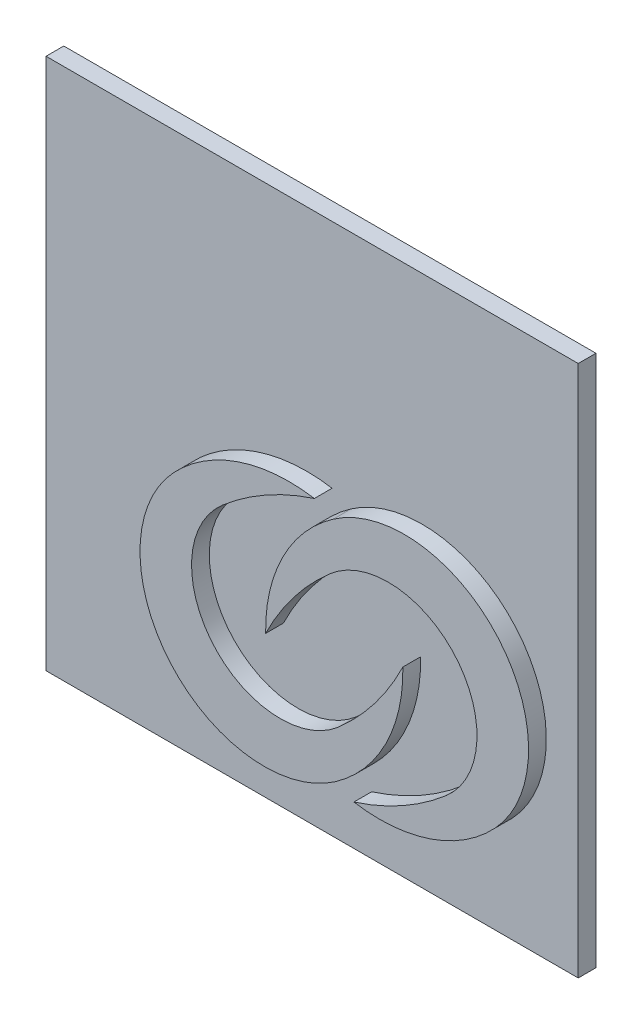
ISO-10303-21;
HEADER;
FILE_DESCRIPTION(('STEP AP214'),'2;1');
FILE_NAME('part.step','',(''),(''),'','','');
FILE_SCHEMA(('AUTOMOTIVE_DESIGN { 1 0 10303 214 1 1 1 1 }'));
ENDSEC;
DATA;
#1=APPLICATION_CONTEXT('core data for automotive mechanical design processes');
#2=APPLICATION_PROTOCOL_DEFINITION('international standard','automotive_design',2000,#1);
#3=PRODUCT_CONTEXT('',#1,'mechanical');
#4=PRODUCT('Part','Part','',(#3));
#5=PRODUCT_RELATED_PRODUCT_CATEGORY('part','',(#4));
#6=PRODUCT_DEFINITION_FORMATION('','',#4);
#7=PRODUCT_DEFINITION_CONTEXT('part definition',#1,'design');
#8=PRODUCT_DEFINITION('design','',#6,#7);
#9=PRODUCT_DEFINITION_SHAPE('','',#8);
#10=(LENGTH_UNIT() NAMED_UNIT(*) SI_UNIT(.MILLI.,.METRE.));
#11=(NAMED_UNIT(*) PLANE_ANGLE_UNIT() SI_UNIT($,.RADIAN.));
#12=(NAMED_UNIT(*) SI_UNIT($,.STERADIAN.) SOLID_ANGLE_UNIT());
#13=UNCERTAINTY_MEASURE_WITH_UNIT(LENGTH_MEASURE(1.E-05),#10,'distance_accuracy_value','');
#14=(GEOMETRIC_REPRESENTATION_CONTEXT(3) GLOBAL_UNCERTAINTY_ASSIGNED_CONTEXT((#13)) GLOBAL_UNIT_ASSIGNED_CONTEXT((#10,
#11,#12)) REPRESENTATION_CONTEXT('',''));
#15=CARTESIAN_POINT('',(0.,0.,0.));
#16=DIRECTION('',(0.,0.,1.));
#17=DIRECTION('',(1.,0.,0.));
#18=AXIS2_PLACEMENT_3D('',#15,#16,#17);
#19=CARTESIAN_POINT('',(0.,0.,10.));
#20=DIRECTION('',(0.,0.,-1.));
#21=DIRECTION('',(-1.,0.,0.));
#22=AXIS2_PLACEMENT_3D('',#19,#20,#21);
#23=PLANE('',#22);
#24=DIRECTION('',(0.,-1.,0.));
#25=VECTOR('',#24,1.);
#26=CARTESIAN_POINT('',(0.,0.,10.));
#27=LINE('',#26,#25);
#28=CARTESIAN_POINT('',(0.,300.,10.));
#29=VERTEX_POINT('',#28);
#30=CARTESIAN_POINT('',(0.,0.,10.));
#31=VERTEX_POINT('',#30);
#32=EDGE_CURVE('E281',#29,#31,#27,.T.);
#33=ORIENTED_EDGE('',*,*,#32,.T.);
#34=DIRECTION('',(1.,0.,0.));
#35=VECTOR('',#34,1.);
#36=CARTESIAN_POINT('',(0.,0.,10.));
#37=LINE('',#36,#35);
#38=CARTESIAN_POINT('',(300.,0.,10.));
#39=VERTEX_POINT('',#38);
#40=EDGE_CURVE('E285',#31,#39,#37,.T.);
#41=ORIENTED_EDGE('',*,*,#40,.T.);
#42=DIRECTION('',(0.,1.,0.));
#43=VECTOR('',#42,1.);
#44=CARTESIAN_POINT('',(300.,0.,10.));
#45=LINE('',#44,#43);
#46=CARTESIAN_POINT('',(300.,300.,10.));
#47=VERTEX_POINT('',#46);
#48=EDGE_CURVE('E289',#39,#47,#45,.T.);
#49=ORIENTED_EDGE('',*,*,#48,.T.);
#50=DIRECTION('',(-1.,0.,0.));
#51=VECTOR('',#50,1.);
#52=CARTESIAN_POINT('',(0.,300.,10.));
#53=LINE('',#52,#51);
#54=EDGE_CURVE('E292',#47,#29,#53,.T.);
#55=ORIENTED_EDGE('',*,*,#54,.T.);
#56=EDGE_LOOP('',(#33,#41,#49,#55));
#57=FACE_BOUND('',#56,.T.);
#58=CARTESIAN_POINT('',(132.984082863177,94.7755978747175,10.));
#59=DIRECTION('',(0.,0.,1.));
#60=DIRECTION('',(1.,0.,0.));
#61=AXIS2_PLACEMENT_3D('',#58,#59,#60);
#62=CIRCLE('',#61,70.0139507725326);
#63=CARTESIAN_POINT('',(81.7478186062919,142.491407914758,10.));
#64=VERTEX_POINT('',#63);
#65=CARTESIAN_POINT('',(173.139331363297,37.4213537364479,10.));
#66=VERTEX_POINT('',#65);
#67=EDGE_CURVE('E163',#64,#66,#62,.T.);
#68=ORIENTED_EDGE('',*,*,#67,.F.);
#69=CARTESIAN_POINT('',(146.984694862725,81.7369707947785,10.));
#70=DIRECTION('',(0.,0.,1.));
#71=DIRECTION('',(1.,0.,0.));
#72=AXIS2_PLACEMENT_3D('',#69,#70,#71);
#73=CIRCLE('',#72,89.1456765831226);
#74=CARTESIAN_POINT('',(161.258214425508,169.732529164241,10.));
#75=VERTEX_POINT('',#74);
#76=EDGE_CURVE('E219',#75,#64,#73,.T.);
#77=ORIENTED_EDGE('',*,*,#76,.F.);
#78=CARTESIAN_POINT('',(207.468864018277,27.0280237545861,10.));
#79=DIRECTION('',(0.,0.,-1.));
#80=DIRECTION('',(-1.,0.,0.));
#81=AXIS2_PLACEMENT_3D('',#78,#79,#80);
#82=CIRCLE('',#81,150.);
#83=CARTESIAN_POINT('',(109.307122532255,140.448800107207,10.));
#84=VERTEX_POINT('',#83);
#85=EDGE_CURVE('E250',#84,#75,#82,.T.);
#86=ORIENTED_EDGE('',*,*,#85,.F.);
#87=CARTESIAN_POINT('',(142.027703027596,102.641874656334,10.));
#88=DIRECTION('',(0.,0.,-1.));
#89=DIRECTION('',(1.,0.,0.));
#90=AXIS2_PLACEMENT_3D('',#87,#88,#89);
#91=CIRCLE('',#90,50.);
#92=CARTESIAN_POINT('',(174.935524438458,64.9978141687771,10.));
#93=VERTEX_POINT('',#92);
#94=EDGE_CURVE('E246',#93,#84,#91,.T.);
#95=ORIENTED_EDGE('',*,*,#94,.F.);
#96=CARTESIAN_POINT('',(76.2120602058715,177.929995631446,10.));
#97=DIRECTION('',(0.,0.,-1.));
#98=DIRECTION('',(1.,0.,0.));
#99=AXIS2_PLACEMENT_3D('',#96,#97,#98);
#100=CIRCLE('',#99,150.);
#101=CARTESIAN_POINT('',(211.135953458384,112.389603279976,10.));
#102=VERTEX_POINT('',#101);
#103=EDGE_CURVE('E242',#102,#93,#100,.T.);
#104=ORIENTED_EDGE('',*,*,#103,.F.);
#105=CARTESIAN_POINT('',(122.011423904731,110.447984032327,10.));
#106=DIRECTION('',(0.,0.,1.));
#107=DIRECTION('',(1.,0.,0.));
#108=AXIS2_PLACEMENT_3D('',#105,#106,#107);
#109=CIRCLE('',#108,89.1456765831226);
#110=EDGE_CURVE('E238',#66,#102,#109,.T.);
#111=ORIENTED_EDGE('',*,*,#110,.F.);
#112=EDGE_LOOP('',(#68,#77,#86,#95,#104,#111));
#113=FACE_BOUND('',#112,.T.);
#114=CARTESIAN_POINT('',(202.932279751849,99.7258628160162,10.));
#115=DIRECTION('',(0.,0.,-1.));
#116=DIRECTION('',(-1.,0.,0.));
#117=AXIS2_PLACEMENT_3D('',#114,#115,#116);
#118=CIRCLE('',#117,49.9999999999999);
#119=CARTESIAN_POINT('',(170.113665312693,137.447720488909,10.));
#120=VERTEX_POINT('',#119);
#121=CARTESIAN_POINT('',(235.563268250012,61.8415838914715,10.));
#122=VERTEX_POINT('',#121);
#123=EDGE_CURVE('E155',#120,#122,#118,.T.);
#124=ORIENTED_EDGE('',*,*,#123,.F.);
#125=CARTESIAN_POINT('',(268.569508630162,24.2821474702303,10.));
#126=DIRECTION('',(0.,0.,-1.));
#127=DIRECTION('',(1.,0.,0.));
#128=AXIS2_PLACEMENT_3D('',#125,#126,#127);
#129=CIRCLE('',#128,150.);
#130=CARTESIAN_POINT('',(133.801147174129,90.1417614264028,10.));
#131=VERTEX_POINT('',#130);
#132=EDGE_CURVE('E157',#131,#120,#129,.T.);
#133=ORIENTED_EDGE('',*,*,#132,.F.);
#134=CARTESIAN_POINT('',(222.93002338985,91.8723907874685,10.));
#135=DIRECTION('',(0.,0.,1.));
#136=DIRECTION('',(-1.,0.,0.));
#137=AXIS2_PLACEMENT_3D('',#134,#135,#136);
#138=CIRCLE('',#137,89.1456765831224);
#139=CARTESIAN_POINT('',(171.975135093275,165.019851523616,10.));
#140=VERTEX_POINT('',#139);
#141=EDGE_CURVE('E175',#140,#131,#138,.T.);
#142=ORIENTED_EDGE('',*,*,#141,.F.);
#143=CARTESIAN_POINT('',(211.994496407895,107.570708599213,10.));
#144=DIRECTION('',(0.,0.,1.));
#145=DIRECTION('',(-1.,0.,0.));
#146=AXIS2_PLACEMENT_3D('',#143,#144,#145);
#147=CIRCLE('',#146,70.0139507725326);
#148=CARTESIAN_POINT('',(263.117659488977,59.7337406835543,10.));
#149=VERTEX_POINT('',#148);
#150=EDGE_CURVE('E193',#149,#140,#147,.T.);
#151=ORIENTED_EDGE('',*,*,#150,.F.);
#152=CARTESIAN_POINT('',(198.024789973031,120.642442784672,10.));
#153=DIRECTION('',(0.,0.,1.));
#154=DIRECTION('',(-1.,0.,0.));
#155=AXIS2_PLACEMENT_3D('',#152,#153,#154);
#156=CIRCLE('',#155,89.1456765831224);
#157=CARTESIAN_POINT('',(183.542998572227,32.6809206782067,10.));
#158=VERTEX_POINT('',#157);
#159=EDGE_CURVE('E66',#158,#149,#156,.T.);
#160=ORIENTED_EDGE('',*,*,#159,.F.);
#161=CARTESIAN_POINT('',(137.670302755521,175.494420665106,10.));
#162=DIRECTION('',(0.,0.,-1.));
#163=DIRECTION('',(-1.,0.,0.));
#164=AXIS2_PLACEMENT_3D('',#161,#162,#163);
#165=CIRCLE('',#164,150.);
#166=EDGE_CURVE('E61',#122,#158,#165,.T.);
#167=ORIENTED_EDGE('',*,*,#166,.F.);
#168=EDGE_LOOP('',(#124,#133,#142,#151,#160,#167));
#169=FACE_BOUND('',#168,.T.);
#170=ADVANCED_FACE('F45',(#57,#113,#169),#23,.F.);
#171=CARTESIAN_POINT('',(0.,0.,10.));
#172=DIRECTION('',(1.,0.,0.));
#173=DIRECTION('',(0.,0.,-1.));
#174=AXIS2_PLACEMENT_3D('',#171,#172,#173);
#175=PLANE('',#174);
#176=DIRECTION('',(0.,-1.,0.));
#177=VECTOR('',#176,1.);
#178=CARTESIAN_POINT('',(0.,0.,0.));
#179=LINE('',#178,#177);
#180=CARTESIAN_POINT('',(0.,300.,0.));
#181=VERTEX_POINT('',#180);
#182=CARTESIAN_POINT('',(0.,0.,0.));
#183=VERTEX_POINT('',#182);
#184=EDGE_CURVE('E280',#181,#183,#179,.T.);
#185=ORIENTED_EDGE('',*,*,#184,.T.);
#186=DIRECTION('',(0.,0.,-1.));
#187=VECTOR('',#186,1.);
#188=CARTESIAN_POINT('',(0.,0.,10.));
#189=LINE('',#188,#187);
#190=EDGE_CURVE('E11',#31,#183,#189,.T.);
#191=ORIENTED_EDGE('',*,*,#190,.F.);
#192=ORIENTED_EDGE('',*,*,#32,.F.);
#193=DIRECTION('',(0.,0.,-1.));
#194=VECTOR('',#193,1.);
#195=CARTESIAN_POINT('',(0.,300.,10.));
#196=LINE('',#195,#194);
#197=EDGE_CURVE('E295',#29,#181,#196,.T.);
#198=ORIENTED_EDGE('',*,*,#197,.T.);
#199=EDGE_LOOP('',(#185,#191,#192,#198));
#200=FACE_BOUND('',#199,.T.);
#201=ADVANCED_FACE('F47',(#200),#175,.F.);
#202=CARTESIAN_POINT('',(0.,0.,10.));
#203=DIRECTION('',(0.,1.,0.));
#204=DIRECTION('',(0.,0.,1.));
#205=AXIS2_PLACEMENT_3D('',#202,#203,#204);
#206=PLANE('',#205);
#207=DIRECTION('',(1.,0.,0.));
#208=VECTOR('',#207,1.);
#209=CARTESIAN_POINT('',(0.,0.,0.));
#210=LINE('',#209,#208);
#211=CARTESIAN_POINT('',(300.,0.,0.));
#212=VERTEX_POINT('',#211);
#213=EDGE_CURVE('E299',#183,#212,#210,.T.);
#214=ORIENTED_EDGE('',*,*,#213,.T.);
#215=DIRECTION('',(0.,0.,-1.));
#216=VECTOR('',#215,1.);
#217=CARTESIAN_POINT('',(300.,0.,10.));
#218=LINE('',#217,#216);
#219=EDGE_CURVE('E54',#39,#212,#218,.T.);
#220=ORIENTED_EDGE('',*,*,#219,.F.);
#221=ORIENTED_EDGE('',*,*,#40,.F.);
#222=ORIENTED_EDGE('',*,*,#190,.T.);
#223=EDGE_LOOP('',(#214,#220,#221,#222));
#224=FACE_BOUND('',#223,.T.);
#225=ADVANCED_FACE('F335',(#224),#206,.F.);
#226=CARTESIAN_POINT('',(300.,0.,10.));
#227=DIRECTION('',(-1.,0.,0.));
#228=DIRECTION('',(0.,0.,1.));
#229=AXIS2_PLACEMENT_3D('',#226,#227,#228);
#230=PLANE('',#229);
#231=DIRECTION('',(0.,1.,0.));
#232=VECTOR('',#231,1.);
#233=CARTESIAN_POINT('',(300.,0.,0.));
#234=LINE('',#233,#232);
#235=CARTESIAN_POINT('',(300.,300.,0.));
#236=VERTEX_POINT('',#235);
#237=EDGE_CURVE('E302',#212,#236,#234,.T.);
#238=ORIENTED_EDGE('',*,*,#237,.T.);
#239=DIRECTION('',(0.,0.,-1.));
#240=VECTOR('',#239,1.);
#241=CARTESIAN_POINT('',(300.,300.,10.));
#242=LINE('',#241,#240);
#243=EDGE_CURVE('E310',#47,#236,#242,.T.);
#244=ORIENTED_EDGE('',*,*,#243,.F.);
#245=ORIENTED_EDGE('',*,*,#48,.F.);
#246=ORIENTED_EDGE('',*,*,#219,.T.);
#247=EDGE_LOOP('',(#238,#244,#245,#246));
#248=FACE_BOUND('',#247,.T.);
#249=ADVANCED_FACE('F319',(#248),#230,.F.);
#250=CARTESIAN_POINT('',(0.,300.,10.));
#251=DIRECTION('',(0.,-1.,0.));
#252=DIRECTION('',(0.,0.,-1.));
#253=AXIS2_PLACEMENT_3D('',#250,#251,#252);
#254=PLANE('',#253);
#255=DIRECTION('',(-1.,0.,0.));
#256=VECTOR('',#255,1.);
#257=CARTESIAN_POINT('',(0.,300.,0.));
#258=LINE('',#257,#256);
#259=EDGE_CURVE('E286',#236,#181,#258,.T.);
#260=ORIENTED_EDGE('',*,*,#259,.T.);
#261=ORIENTED_EDGE('',*,*,#197,.F.);
#262=ORIENTED_EDGE('',*,*,#54,.F.);
#263=ORIENTED_EDGE('',*,*,#243,.T.);
#264=EDGE_LOOP('',(#260,#261,#262,#263));
#265=FACE_BOUND('',#264,.T.);
#266=ADVANCED_FACE('F328',(#265),#254,.F.);
#267=CARTESIAN_POINT('',(0.,0.,0.));
#268=DIRECTION('',(0.,0.,-1.));
#269=DIRECTION('',(-1.,0.,0.));
#270=AXIS2_PLACEMENT_3D('',#267,#268,#269);
#271=PLANE('',#270);
#272=ORIENTED_EDGE('',*,*,#184,.F.);
#273=ORIENTED_EDGE('',*,*,#259,.F.);
#274=ORIENTED_EDGE('',*,*,#237,.F.);
#275=ORIENTED_EDGE('',*,*,#213,.F.);
#276=EDGE_LOOP('',(#272,#273,#274,#275));
#277=FACE_BOUND('',#276,.T.);
#278=ADVANCED_FACE('F325',(#277),#271,.T.);
#279=CARTESIAN_POINT('',(132.984082863177,94.7755978747175,20.));
#280=DIRECTION('',(0.,0.,-1.));
#281=DIRECTION('',(-1.,0.,0.));
#282=AXIS2_PLACEMENT_3D('',#279,#280,#281);
#283=CYLINDRICAL_SURFACE('',#282,70.0139507725326);
#284=ORIENTED_EDGE('',*,*,#67,.T.);
#285=DIRECTION('',(0.,0.,-1.));
#286=VECTOR('',#285,1.);
#287=CARTESIAN_POINT('',(173.139331363297,37.4213537364479,20.));
#288=LINE('',#287,#286);
#289=CARTESIAN_POINT('',(173.139331363297,37.4213537364479,20.));
#290=VERTEX_POINT('',#289);
#291=EDGE_CURVE('E276',#290,#66,#288,.T.);
#292=ORIENTED_EDGE('',*,*,#291,.F.);
#293=CARTESIAN_POINT('',(132.984082863177,94.7755978747175,20.));
#294=DIRECTION('',(0.,0.,1.));
#295=DIRECTION('',(1.,0.,0.));
#296=AXIS2_PLACEMENT_3D('',#293,#294,#295);
#297=CIRCLE('',#296,70.0139507725326);
#298=CARTESIAN_POINT('',(81.7478186062919,142.491407914758,20.));
#299=VERTEX_POINT('',#298);
#300=EDGE_CURVE('E214',#299,#290,#297,.T.);
#301=ORIENTED_EDGE('',*,*,#300,.F.);
#302=DIRECTION('',(0.,0.,-1.));
#303=VECTOR('',#302,1.);
#304=CARTESIAN_POINT('',(81.7478186062919,142.491407914758,20.));
#305=LINE('',#304,#303);
#306=EDGE_CURVE('E234',#299,#64,#305,.T.);
#307=ORIENTED_EDGE('',*,*,#306,.T.);
#308=EDGE_LOOP('',(#284,#292,#301,#307));
#309=FACE_BOUND('',#308,.T.);
#310=ADVANCED_FACE('F350',(#309),#283,.T.);
#311=CARTESIAN_POINT('',(122.011423904731,110.447984032327,20.));
#312=DIRECTION('',(0.,0.,-1.));
#313=DIRECTION('',(-1.,0.,0.));
#314=AXIS2_PLACEMENT_3D('',#311,#312,#313);
#315=CYLINDRICAL_SURFACE('',#314,89.1456765831226);
#316=ORIENTED_EDGE('',*,*,#110,.T.);
#317=DIRECTION('',(0.,0.,-1.));
#318=VECTOR('',#317,1.);
#319=CARTESIAN_POINT('',(211.135953458384,112.389603279976,20.));
#320=LINE('',#319,#318);
#321=CARTESIAN_POINT('',(211.135953458384,112.389603279976,20.));
#322=VERTEX_POINT('',#321);
#323=EDGE_CURVE('E272',#322,#102,#320,.T.);
#324=ORIENTED_EDGE('',*,*,#323,.F.);
#325=CARTESIAN_POINT('',(122.011423904731,110.447984032327,20.));
#326=DIRECTION('',(0.,0.,1.));
#327=DIRECTION('',(1.,0.,0.));
#328=AXIS2_PLACEMENT_3D('',#325,#326,#327);
#329=CIRCLE('',#328,89.1456765831226);
#330=EDGE_CURVE('E218',#290,#322,#329,.T.);
#331=ORIENTED_EDGE('',*,*,#330,.F.);
#332=ORIENTED_EDGE('',*,*,#291,.T.);
#333=EDGE_LOOP('',(#316,#324,#331,#332));
#334=FACE_BOUND('',#333,.T.);
#335=ADVANCED_FACE('F376',(#334),#315,.T.);
#336=CARTESIAN_POINT('',(76.2120602058715,177.929995631446,20.));
#337=DIRECTION('',(0.,0.,-1.));
#338=DIRECTION('',(-1.,0.,0.));
#339=AXIS2_PLACEMENT_3D('',#336,#337,#338);
#340=CYLINDRICAL_SURFACE('',#339,150.);
#341=ORIENTED_EDGE('',*,*,#103,.T.);
#342=DIRECTION('',(0.,0.,-1.));
#343=VECTOR('',#342,1.);
#344=CARTESIAN_POINT('',(174.935524438458,64.9978141687771,20.));
#345=LINE('',#344,#343);
#346=CARTESIAN_POINT('',(174.935524438458,64.9978141687771,20.));
#347=VERTEX_POINT('',#346);
#348=EDGE_CURVE('E268',#347,#93,#345,.T.);
#349=ORIENTED_EDGE('',*,*,#348,.F.);
#350=CARTESIAN_POINT('',(76.2120602058715,177.929995631446,20.));
#351=DIRECTION('',(0.,0.,-1.));
#352=DIRECTION('',(1.,0.,0.));
#353=AXIS2_PLACEMENT_3D('',#350,#351,#352);
#354=CIRCLE('',#353,150.);
#355=EDGE_CURVE('E222',#322,#347,#354,.T.);
#356=ORIENTED_EDGE('',*,*,#355,.F.);
#357=ORIENTED_EDGE('',*,*,#323,.T.);
#358=EDGE_LOOP('',(#341,#349,#356,#357));
#359=FACE_BOUND('',#358,.T.);
#360=ADVANCED_FACE('F385',(#359),#340,.F.);
#361=CARTESIAN_POINT('',(142.027703027596,102.641874656334,20.));
#362=DIRECTION('',(0.,0.,-1.));
#363=DIRECTION('',(-1.,0.,0.));
#364=AXIS2_PLACEMENT_3D('',#361,#362,#363);
#365=CYLINDRICAL_SURFACE('',#364,50.);
#366=ORIENTED_EDGE('',*,*,#94,.T.);
#367=DIRECTION('',(0.,0.,-1.));
#368=VECTOR('',#367,1.);
#369=CARTESIAN_POINT('',(109.307122532255,140.448800107207,20.));
#370=LINE('',#369,#368);
#371=CARTESIAN_POINT('',(109.307122532255,140.448800107207,20.));
#372=VERTEX_POINT('',#371);
#373=EDGE_CURVE('E264',#372,#84,#370,.T.);
#374=ORIENTED_EDGE('',*,*,#373,.F.);
#375=CARTESIAN_POINT('',(142.027703027596,102.641874656334,20.));
#376=DIRECTION('',(0.,0.,-1.));
#377=DIRECTION('',(1.,0.,0.));
#378=AXIS2_PLACEMENT_3D('',#375,#376,#377);
#379=CIRCLE('',#378,50.);
#380=EDGE_CURVE('E225',#347,#372,#379,.T.);
#381=ORIENTED_EDGE('',*,*,#380,.F.);
#382=ORIENTED_EDGE('',*,*,#348,.T.);
#383=EDGE_LOOP('',(#366,#374,#381,#382));
#384=FACE_BOUND('',#383,.T.);
#385=ADVANCED_FACE('F394',(#384),#365,.F.);
#386=CARTESIAN_POINT('',(207.468864018277,27.0280237545861,20.));
#387=DIRECTION('',(0.,0.,-1.));
#388=DIRECTION('',(-1.,0.,0.));
#389=AXIS2_PLACEMENT_3D('',#386,#387,#388);
#390=CYLINDRICAL_SURFACE('',#389,150.);
#391=ORIENTED_EDGE('',*,*,#85,.T.);
#392=DIRECTION('',(0.,0.,-1.));
#393=VECTOR('',#392,1.);
#394=CARTESIAN_POINT('',(161.258214425508,169.732529164241,20.));
#395=LINE('',#394,#393);
#396=CARTESIAN_POINT('',(161.258214425508,169.732529164241,20.));
#397=VERTEX_POINT('',#396);
#398=EDGE_CURVE('E260',#397,#75,#395,.T.);
#399=ORIENTED_EDGE('',*,*,#398,.F.);
#400=CARTESIAN_POINT('',(207.468864018277,27.0280237545861,20.));
#401=DIRECTION('',(0.,0.,-1.));
#402=DIRECTION('',(-1.,0.,0.));
#403=AXIS2_PLACEMENT_3D('',#400,#401,#402);
#404=CIRCLE('',#403,150.);
#405=EDGE_CURVE('E228',#372,#397,#404,.T.);
#406=ORIENTED_EDGE('',*,*,#405,.F.);
#407=ORIENTED_EDGE('',*,*,#373,.T.);
#408=EDGE_LOOP('',(#391,#399,#406,#407));
#409=FACE_BOUND('',#408,.T.);
#410=ADVANCED_FACE('F404',(#409),#390,.F.);
#411=CARTESIAN_POINT('',(146.984694862725,81.7369707947785,20.));
#412=DIRECTION('',(0.,0.,-1.));
#413=DIRECTION('',(-1.,0.,0.));
#414=AXIS2_PLACEMENT_3D('',#411,#412,#413);
#415=CYLINDRICAL_SURFACE('',#414,89.1456765831226);
#416=ORIENTED_EDGE('',*,*,#76,.T.);
#417=ORIENTED_EDGE('',*,*,#306,.F.);
#418=CARTESIAN_POINT('',(146.984694862725,81.7369707947785,20.));
#419=DIRECTION('',(0.,0.,1.));
#420=DIRECTION('',(1.,0.,0.));
#421=AXIS2_PLACEMENT_3D('',#418,#419,#420);
#422=CIRCLE('',#421,89.1456765831226);
#423=EDGE_CURVE('E231',#397,#299,#422,.T.);
#424=ORIENTED_EDGE('',*,*,#423,.F.);
#425=ORIENTED_EDGE('',*,*,#398,.T.);
#426=EDGE_LOOP('',(#416,#417,#424,#425));
#427=FACE_BOUND('',#426,.T.);
#428=ADVANCED_FACE('F414',(#427),#415,.T.);
#429=CARTESIAN_POINT('',(127.497753383954,102.611790953522,20.));
#430=DIRECTION('',(0.,0.,1.));
#431=DIRECTION('',(1.,0.,0.));
#432=AXIS2_PLACEMENT_3D('',#429,#430,#431);
#433=PLANE('',#432);
#434=ORIENTED_EDGE('',*,*,#300,.T.);
#435=ORIENTED_EDGE('',*,*,#330,.T.);
#436=ORIENTED_EDGE('',*,*,#355,.T.);
#437=ORIENTED_EDGE('',*,*,#380,.T.);
#438=ORIENTED_EDGE('',*,*,#405,.T.);
#439=ORIENTED_EDGE('',*,*,#423,.T.);
#440=EDGE_LOOP('',(#434,#435,#436,#437,#438,#439));
#441=FACE_BOUND('',#440,.T.);
#442=ADVANCED_FACE('F424',(#441),#433,.T.);
#443=CARTESIAN_POINT('',(202.932279751849,99.7258628160162,20.));
#444=DIRECTION('',(0.,0.,-1.));
#445=DIRECTION('',(-1.,0.,0.));
#446=AXIS2_PLACEMENT_3D('',#443,#444,#445);
#447=CYLINDRICAL_SURFACE('',#446,49.9999999999999);
#448=ORIENTED_EDGE('',*,*,#123,.T.);
#449=DIRECTION('',(0.,0.,-1.));
#450=VECTOR('',#449,1.);
#451=CARTESIAN_POINT('',(235.563268250012,61.8415838914715,20.));
#452=LINE('',#451,#450);
#453=CARTESIAN_POINT('',(235.563268250012,61.8415838914715,20.));
#454=VERTEX_POINT('',#453);
#455=EDGE_CURVE('E504',#454,#122,#452,.T.);
#456=ORIENTED_EDGE('',*,*,#455,.F.);
#457=CARTESIAN_POINT('',(202.932279751849,99.7258628160162,20.));
#458=DIRECTION('',(0.,0.,-1.));
#459=DIRECTION('',(-1.,0.,0.));
#460=AXIS2_PLACEMENT_3D('',#457,#458,#459);
#461=CIRCLE('',#460,49.9999999999999);
#462=CARTESIAN_POINT('',(170.113665312693,137.447720488909,20.));
#463=VERTEX_POINT('',#462);
#464=EDGE_CURVE('E176',#463,#454,#461,.T.);
#465=ORIENTED_EDGE('',*,*,#464,.F.);
#466=DIRECTION('',(0.,0.,-1.));
#467=VECTOR('',#466,1.);
#468=CARTESIAN_POINT('',(170.113665312693,137.447720488909,20.));
#469=LINE('',#468,#467);
#470=EDGE_CURVE('E170',#463,#120,#469,.T.);
#471=ORIENTED_EDGE('',*,*,#470,.T.);
#472=EDGE_LOOP('',(#448,#456,#465,#471));
#473=FACE_BOUND('',#472,.T.);
#474=ADVANCED_FACE('F178',(#473),#447,.F.);
#475=CARTESIAN_POINT('',(137.670302755521,175.494420665106,20.));
#476=DIRECTION('',(0.,0.,-1.));
#477=DIRECTION('',(-1.,0.,0.));
#478=AXIS2_PLACEMENT_3D('',#475,#476,#477);
#479=CYLINDRICAL_SURFACE('',#478,150.);
#480=ORIENTED_EDGE('',*,*,#166,.T.);
#481=DIRECTION('',(0.,0.,-1.));
#482=VECTOR('',#481,1.);
#483=CARTESIAN_POINT('',(183.542998572227,32.6809206782068,20.));
#484=LINE('',#483,#482);
#485=CARTESIAN_POINT('',(183.542998572227,32.6809206782068,20.));
#486=VERTEX_POINT('',#485);
#487=EDGE_CURVE('E506',#486,#158,#484,.T.);
#488=ORIENTED_EDGE('',*,*,#487,.F.);
#489=CARTESIAN_POINT('',(137.670302755521,175.494420665106,20.));
#490=DIRECTION('',(0.,0.,-1.));
#491=DIRECTION('',(-1.,0.,0.));
#492=AXIS2_PLACEMENT_3D('',#489,#490,#491);
#493=CIRCLE('',#492,150.);
#494=EDGE_CURVE('E209',#454,#486,#493,.T.);
#495=ORIENTED_EDGE('',*,*,#494,.F.);
#496=ORIENTED_EDGE('',*,*,#455,.T.);
#497=EDGE_LOOP('',(#480,#488,#495,#496));
#498=FACE_BOUND('',#497,.T.);
#499=ADVANCED_FACE('F443',(#498),#479,.F.);
#500=CARTESIAN_POINT('',(198.024789973031,120.642442784672,20.));
#501=DIRECTION('',(0.,0.,-1.));
#502=DIRECTION('',(-1.,0.,0.));
#503=AXIS2_PLACEMENT_3D('',#500,#501,#502);
#504=CYLINDRICAL_SURFACE('',#503,89.1456765831224);
#505=ORIENTED_EDGE('',*,*,#159,.T.);
#506=DIRECTION('',(0.,0.,-1.));
#507=VECTOR('',#506,1.);
#508=CARTESIAN_POINT('',(263.117659488977,59.7337406835543,20.));
#509=LINE('',#508,#507);
#510=CARTESIAN_POINT('',(263.117659488977,59.7337406835543,20.));
#511=VERTEX_POINT('',#510);
#512=EDGE_CURVE('E510',#511,#149,#509,.T.);
#513=ORIENTED_EDGE('',*,*,#512,.F.);
#514=CARTESIAN_POINT('',(198.024789973031,120.642442784672,20.));
#515=DIRECTION('',(0.,0.,1.));
#516=DIRECTION('',(-1.,0.,0.));
#517=AXIS2_PLACEMENT_3D('',#514,#515,#516);
#518=CIRCLE('',#517,89.1456765831224);
#519=EDGE_CURVE('E206',#486,#511,#518,.T.);
#520=ORIENTED_EDGE('',*,*,#519,.F.);
#521=ORIENTED_EDGE('',*,*,#487,.T.);
#522=EDGE_LOOP('',(#505,#513,#520,#521));
#523=FACE_BOUND('',#522,.T.);
#524=ADVANCED_FACE('F452',(#523),#504,.T.);
#525=CARTESIAN_POINT('',(211.994496407895,107.570708599213,20.));
#526=DIRECTION('',(0.,0.,-1.));
#527=DIRECTION('',(-1.,0.,0.));
#528=AXIS2_PLACEMENT_3D('',#525,#526,#527);
#529=CYLINDRICAL_SURFACE('',#528,70.0139507725326);
#530=ORIENTED_EDGE('',*,*,#150,.T.);
#531=DIRECTION('',(0.,0.,-1.));
#532=VECTOR('',#531,1.);
#533=CARTESIAN_POINT('',(171.975135093275,165.019851523616,20.));
#534=LINE('',#533,#532);
#535=CARTESIAN_POINT('',(171.975135093275,165.019851523616,20.));
#536=VERTEX_POINT('',#535);
#537=EDGE_CURVE('E187',#536,#140,#534,.T.);
#538=ORIENTED_EDGE('',*,*,#537,.F.);
#539=CARTESIAN_POINT('',(211.994496407895,107.570708599213,20.));
#540=DIRECTION('',(0.,0.,1.));
#541=DIRECTION('',(-1.,0.,0.));
#542=AXIS2_PLACEMENT_3D('',#539,#540,#541);
#543=CIRCLE('',#542,70.0139507725326);
#544=EDGE_CURVE('E203',#511,#536,#543,.T.);
#545=ORIENTED_EDGE('',*,*,#544,.F.);
#546=ORIENTED_EDGE('',*,*,#512,.T.);
#547=EDGE_LOOP('',(#530,#538,#545,#546));
#548=FACE_BOUND('',#547,.T.);
#549=ADVANCED_FACE('F462',(#548),#529,.T.);
#550=CARTESIAN_POINT('',(222.93002338985,91.8723907874685,20.));
#551=DIRECTION('',(0.,0.,-1.));
#552=DIRECTION('',(-1.,0.,0.));
#553=AXIS2_PLACEMENT_3D('',#550,#551,#552);
#554=CYLINDRICAL_SURFACE('',#553,89.1456765831224);
#555=ORIENTED_EDGE('',*,*,#141,.T.);
#556=DIRECTION('',(0.,0.,-1.));
#557=VECTOR('',#556,1.);
#558=CARTESIAN_POINT('',(133.801147174129,90.1417614264029,20.));
#559=LINE('',#558,#557);
#560=CARTESIAN_POINT('',(133.801147174129,90.1417614264029,20.));
#561=VERTEX_POINT('',#560);
#562=EDGE_CURVE('E173',#561,#131,#559,.T.);
#563=ORIENTED_EDGE('',*,*,#562,.F.);
#564=CARTESIAN_POINT('',(222.93002338985,91.8723907874685,20.));
#565=DIRECTION('',(0.,0.,1.));
#566=DIRECTION('',(-1.,0.,0.));
#567=AXIS2_PLACEMENT_3D('',#564,#565,#566);
#568=CIRCLE('',#567,89.1456765831224);
#569=EDGE_CURVE('E185',#536,#561,#568,.T.);
#570=ORIENTED_EDGE('',*,*,#569,.F.);
#571=ORIENTED_EDGE('',*,*,#537,.T.);
#572=EDGE_LOOP('',(#555,#563,#570,#571));
#573=FACE_BOUND('',#572,.T.);
#574=ADVANCED_FACE('F472',(#573),#554,.T.);
#575=CARTESIAN_POINT('',(268.569508630162,24.2821474702303,20.));
#576=DIRECTION('',(0.,0.,-1.));
#577=DIRECTION('',(-1.,0.,0.));
#578=AXIS2_PLACEMENT_3D('',#575,#576,#577);
#579=CYLINDRICAL_SURFACE('',#578,150.);
#580=ORIENTED_EDGE('',*,*,#132,.T.);
#581=ORIENTED_EDGE('',*,*,#470,.F.);
#582=CARTESIAN_POINT('',(268.569508630162,24.2821474702303,20.));
#583=DIRECTION('',(0.,0.,-1.));
#584=DIRECTION('',(1.,0.,0.));
#585=AXIS2_PLACEMENT_3D('',#582,#583,#584);
#586=CIRCLE('',#585,150.);
#587=EDGE_CURVE('E181',#561,#463,#586,.T.);
#588=ORIENTED_EDGE('',*,*,#587,.F.);
#589=ORIENTED_EDGE('',*,*,#562,.T.);
#590=EDGE_LOOP('',(#580,#581,#588,#589));
#591=FACE_BOUND('',#590,.T.);
#592=ADVANCED_FACE('F168',(#591),#579,.F.);
#593=CARTESIAN_POINT('',(170.301291253685,137.610141740561,20.));
#594=DIRECTION('',(0.,0.,-1.));
#595=DIRECTION('',(-1.,0.,0.));
#596=AXIS2_PLACEMENT_3D('',#593,#594,#595);
#597=PLANE('',#596);
#598=ORIENTED_EDGE('',*,*,#464,.T.);
#599=ORIENTED_EDGE('',*,*,#494,.T.);
#600=ORIENTED_EDGE('',*,*,#519,.T.);
#601=ORIENTED_EDGE('',*,*,#544,.T.);
#602=ORIENTED_EDGE('',*,*,#569,.T.);
#603=ORIENTED_EDGE('',*,*,#587,.T.);
#604=EDGE_LOOP('',(#598,#599,#600,#601,#602,#603));
#605=FACE_BOUND('',#604,.T.);
#606=ADVANCED_FACE('F491',(#605),#597,.F.);
#607=CLOSED_SHELL('',(#170,#201,#225,#249,#266,#278,#310,#335,#360,#385,#410,#428,#442,#474,
#499,#524,#549,#574,#592,#606));
#608=MANIFOLD_SOLID_BREP('B2',#607);
#609=ADVANCED_BREP_SHAPE_REPRESENTATION('',(#18,#608),#14);
#610=SHAPE_DEFINITION_REPRESENTATION(#9,#609);
ENDSEC;
END-ISO-10303-21;
